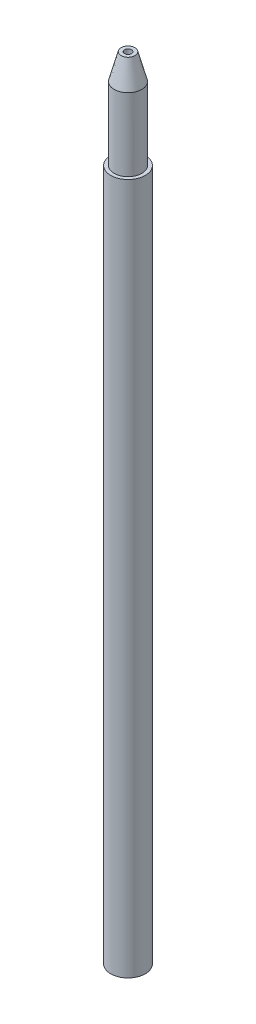
ISO-10303-21;
HEADER;
FILE_DESCRIPTION(('STEP AP214'),'2;1');
FILE_NAME('part.step','',(''),(''),'','','');
FILE_SCHEMA(('AUTOMOTIVE_DESIGN { 1 0 10303 214 1 1 1 1 }'));
ENDSEC;
DATA;
#1=APPLICATION_CONTEXT('core data for automotive mechanical design processes');
#2=APPLICATION_PROTOCOL_DEFINITION('international standard','automotive_design',2000,#1);
#3=PRODUCT_CONTEXT('',#1,'mechanical');
#4=PRODUCT('Part','Part','',(#3));
#5=PRODUCT_RELATED_PRODUCT_CATEGORY('part','',(#4));
#6=PRODUCT_DEFINITION_FORMATION('','',#4);
#7=PRODUCT_DEFINITION_CONTEXT('part definition',#1,'design');
#8=PRODUCT_DEFINITION('design','',#6,#7);
#9=PRODUCT_DEFINITION_SHAPE('','',#8);
#10=(LENGTH_UNIT() NAMED_UNIT(*) SI_UNIT(.MILLI.,.METRE.));
#11=(NAMED_UNIT(*) PLANE_ANGLE_UNIT() SI_UNIT($,.RADIAN.));
#12=(NAMED_UNIT(*) SI_UNIT($,.STERADIAN.) SOLID_ANGLE_UNIT());
#13=UNCERTAINTY_MEASURE_WITH_UNIT(LENGTH_MEASURE(1.E-05),#10,'distance_accuracy_value','');
#14=(GEOMETRIC_REPRESENTATION_CONTEXT(3) GLOBAL_UNCERTAINTY_ASSIGNED_CONTEXT((#13)) GLOBAL_UNIT_ASSIGNED_CONTEXT((#10,
#11,#12)) REPRESENTATION_CONTEXT('',''));
#15=CARTESIAN_POINT('',(0.,0.,0.));
#16=DIRECTION('',(0.,0.,1.));
#17=DIRECTION('',(1.,0.,0.));
#18=AXIS2_PLACEMENT_3D('',#15,#16,#17);
#19=CARTESIAN_POINT('',(1.00000000000001,-35.,0.));
#20=DIRECTION('',(0.,-1.,0.));
#21=DIRECTION('',(0.,0.,-1.));
#22=AXIS2_PLACEMENT_3D('',#19,#20,#21);
#23=PLANE('',#22);
#24=CARTESIAN_POINT('',(0.,-35.,0.));
#25=DIRECTION('',(0.,-1.,0.));
#26=DIRECTION('',(0.,0.,-1.));
#27=AXIS2_PLACEMENT_3D('',#24,#25,#26);
#28=CIRCLE('',#27,1.5);
#29=CARTESIAN_POINT('',(0.,-35.,-1.5));
#30=VERTEX_POINT('',#29);
#31=EDGE_CURVE('E67',#30,#30,#28,.T.);
#32=ORIENTED_EDGE('',*,*,#31,.F.);
#33=EDGE_LOOP('',(#32));
#34=FACE_BOUND('',#33,.T.);
#35=CARTESIAN_POINT('',(0.,-35.,0.));
#36=DIRECTION('',(0.,-1.,0.));
#37=DIRECTION('',(0.,0.,-1.));
#38=AXIS2_PLACEMENT_3D('',#35,#36,#37);
#39=CIRCLE('',#38,5.00000000000001);
#40=CARTESIAN_POINT('',(0.,-35.,-5.00000000000001));
#41=VERTEX_POINT('',#40);
#42=EDGE_CURVE('E55',#41,#41,#39,.T.);
#43=ORIENTED_EDGE('',*,*,#42,.T.);
#44=EDGE_LOOP('',(#43));
#45=FACE_BOUND('',#44,.T.);
#46=ADVANCED_FACE('F35',(#34,#45),#23,.T.);
#47=CARTESIAN_POINT('',(0.,0.,0.));
#48=DIRECTION('',(0.,-1.,0.));
#49=DIRECTION('',(0.,0.,-1.));
#50=AXIS2_PLACEMENT_3D('',#47,#48,#49);
#51=CYLINDRICAL_SURFACE('',#50,1.);
#52=CARTESIAN_POINT('',(0.,5.30043030951379,0.));
#53=DIRECTION('',(0.,-1.,0.));
#54=DIRECTION('',(0.,0.,-1.));
#55=AXIS2_PLACEMENT_3D('',#52,#53,#54);
#56=CIRCLE('',#55,1.);
#57=CARTESIAN_POINT('',(0.,5.30043030951379,-1.));
#58=VERTEX_POINT('',#57);
#59=EDGE_CURVE('E53',#58,#58,#56,.F.);
#60=ORIENTED_EDGE('',*,*,#59,.F.);
#61=EDGE_LOOP('',(#60));
#62=FACE_BOUND('',#61,.T.);
#63=CARTESIAN_POINT('',(0.,193.5,0.));
#64=DIRECTION('',(0.,-1.,0.));
#65=DIRECTION('',(0.,0.,-1.));
#66=AXIS2_PLACEMENT_3D('',#63,#64,#65);
#67=CIRCLE('',#66,1.);
#68=CARTESIAN_POINT('',(0.,193.5,-1.));
#69=VERTEX_POINT('',#68);
#70=EDGE_CURVE('E46',#69,#69,#67,.T.);
#71=ORIENTED_EDGE('',*,*,#70,.F.);
#72=EDGE_LOOP('',(#71));
#73=FACE_BOUND('',#72,.T.);
#74=ADVANCED_FACE('F75',(#62,#73),#51,.F.);
#75=CARTESIAN_POINT('',(1.,193.5,0.));
#76=DIRECTION('',(0.,1.,0.));
#77=DIRECTION('',(0.,0.,1.));
#78=AXIS2_PLACEMENT_3D('',#75,#76,#77);
#79=PLANE('',#78);
#80=CARTESIAN_POINT('',(0.,193.5,0.));
#81=DIRECTION('',(0.,1.,0.));
#82=DIRECTION('',(0.,0.,1.));
#83=AXIS2_PLACEMENT_3D('',#80,#81,#82);
#84=CIRCLE('',#83,1.9999999999999);
#85=CARTESIAN_POINT('',(0.,193.5,1.9999999999999));
#86=VERTEX_POINT('',#85);
#87=EDGE_CURVE('E10',#86,#86,#84,.T.);
#88=ORIENTED_EDGE('',*,*,#87,.T.);
#89=EDGE_LOOP('',(#88));
#90=FACE_BOUND('',#89,.T.);
#91=ORIENTED_EDGE('',*,*,#70,.T.);
#92=EDGE_LOOP('',(#91));
#93=FACE_BOUND('',#92,.T.);
#94=ADVANCED_FACE('F97',(#90,#93),#79,.T.);
#95=CARTESIAN_POINT('',(0.,0.,0.));
#96=DIRECTION('',(0.,-1.,0.));
#97=DIRECTION('',(0.,0.,-1.));
#98=AXIS2_PLACEMENT_3D('',#95,#96,#97);
#99=CYLINDRICAL_SURFACE('',#98,3.99999999999999);
#100=CARTESIAN_POINT('',(0.,186.035898384862,0.));
#101=DIRECTION('',(0.,1.,0.));
#102=DIRECTION('',(0.,0.,1.));
#103=AXIS2_PLACEMENT_3D('',#100,#101,#102);
#104=CIRCLE('',#103,3.99999999999999);
#105=CARTESIAN_POINT('',(0.,186.035898384862,3.99999999999999));
#106=VERTEX_POINT('',#105);
#107=EDGE_CURVE('E42',#106,#106,#104,.F.);
#108=ORIENTED_EDGE('',*,*,#107,.T.);
#109=EDGE_LOOP('',(#108));
#110=FACE_BOUND('',#109,.T.);
#111=CARTESIAN_POINT('',(0.,165.,0.));
#112=DIRECTION('',(0.,-1.,0.));
#113=DIRECTION('',(0.,0.,-1.));
#114=AXIS2_PLACEMENT_3D('',#111,#112,#113);
#115=CIRCLE('',#114,3.99999999999999);
#116=CARTESIAN_POINT('',(0.,165.,-3.99999999999999));
#117=VERTEX_POINT('',#116);
#118=EDGE_CURVE('E50',#117,#117,#115,.T.);
#119=ORIENTED_EDGE('',*,*,#118,.F.);
#120=EDGE_LOOP('',(#119));
#121=FACE_BOUND('',#120,.T.);
#122=ADVANCED_FACE('F90',(#110,#121),#99,.T.);
#123=CARTESIAN_POINT('',(3.99999999999999,165.,0.));
#124=DIRECTION('',(0.,1.,0.));
#125=DIRECTION('',(0.,0.,1.));
#126=AXIS2_PLACEMENT_3D('',#123,#124,#125);
#127=PLANE('',#126);
#128=ORIENTED_EDGE('',*,*,#118,.T.);
#129=EDGE_LOOP('',(#128));
#130=FACE_BOUND('',#129,.T.);
#131=CARTESIAN_POINT('',(0.,165.,0.));
#132=DIRECTION('',(0.,-1.,0.));
#133=DIRECTION('',(0.,0.,-1.));
#134=AXIS2_PLACEMENT_3D('',#131,#132,#133);
#135=CIRCLE('',#134,4.99999999999998);
#136=CARTESIAN_POINT('',(0.,165.,-4.99999999999998));
#137=VERTEX_POINT('',#136);
#138=EDGE_CURVE('E60',#137,#137,#135,.T.);
#139=ORIENTED_EDGE('',*,*,#138,.F.);
#140=EDGE_LOOP('',(#139));
#141=FACE_BOUND('',#140,.T.);
#142=ADVANCED_FACE('F81',(#130,#141),#127,.T.);
#143=CARTESIAN_POINT('',(0.,0.,0.));
#144=DIRECTION('',(0.,-1.,0.));
#145=DIRECTION('',(0.,0.,-1.));
#146=AXIS2_PLACEMENT_3D('',#143,#144,#145);
#147=CYLINDRICAL_SURFACE('',#146,5.);
#148=ORIENTED_EDGE('',*,*,#138,.T.);
#149=EDGE_LOOP('',(#148));
#150=FACE_BOUND('',#149,.T.);
#151=ORIENTED_EDGE('',*,*,#42,.F.);
#152=EDGE_LOOP('',(#151));
#153=FACE_BOUND('',#152,.T.);
#154=ADVANCED_FACE('F78',(#150,#153),#147,.T.);
#155=CARTESIAN_POINT('',(0.,5.00000000000001,0.));
#156=DIRECTION('',(0.,-1.,0.));
#157=DIRECTION('',(0.,0.,-1.));
#158=AXIS2_PLACEMENT_3D('',#155,#156,#157);
#159=CONICAL_SURFACE('',#158,1.49999999999999,1.02974425867665);
#160=ORIENTED_EDGE('',*,*,#59,.T.);
#161=EDGE_LOOP('',(#160));
#162=FACE_BOUND('',#161,.T.);
#163=CARTESIAN_POINT('',(0.,5.00000000000001,0.));
#164=DIRECTION('',(0.,-1.,0.));
#165=DIRECTION('',(0.,0.,-1.));
#166=AXIS2_PLACEMENT_3D('',#163,#164,#165);
#167=CIRCLE('',#166,1.49999999999999);
#168=CARTESIAN_POINT('',(0.,5.00000000000001,-1.49999999999999));
#169=VERTEX_POINT('',#168);
#170=EDGE_CURVE('E56',#169,#169,#167,.T.);
#171=ORIENTED_EDGE('',*,*,#170,.T.);
#172=EDGE_LOOP('',(#171));
#173=FACE_BOUND('',#172,.T.);
#174=ADVANCED_FACE('F80',(#162,#173),#159,.F.);
#175=CARTESIAN_POINT('',(0.,-35.,0.));
#176=DIRECTION('',(0.,-1.,0.));
#177=DIRECTION('',(0.,0.,-1.));
#178=AXIS2_PLACEMENT_3D('',#175,#176,#177);
#179=CYLINDRICAL_SURFACE('',#178,1.49999999999999);
#180=ORIENTED_EDGE('',*,*,#170,.F.);
#181=EDGE_LOOP('',(#180));
#182=FACE_BOUND('',#181,.T.);
#183=ORIENTED_EDGE('',*,*,#31,.T.);
#184=EDGE_LOOP('',(#183));
#185=FACE_BOUND('',#184,.T.);
#186=ADVANCED_FACE('F71',(#182,#185),#179,.F.);
#187=CARTESIAN_POINT('',(0.,186.035898384862,0.));
#188=DIRECTION('',(0.,-1.,0.));
#189=DIRECTION('',(0.,0.,-1.));
#190=AXIS2_PLACEMENT_3D('',#187,#188,#189);
#191=CONICAL_SURFACE('',#190,3.99999999999999,0.261799387799148);
#192=ORIENTED_EDGE('',*,*,#87,.F.);
#193=EDGE_LOOP('',(#192));
#194=FACE_BOUND('',#193,.T.);
#195=ORIENTED_EDGE('',*,*,#107,.F.);
#196=EDGE_LOOP('',(#195));
#197=FACE_BOUND('',#196,.T.);
#198=ADVANCED_FACE('F37',(#194,#197),#191,.T.);
#199=CLOSED_SHELL('',(#46,#74,#94,#122,#142,#154,#174,#186,#198));
#200=MANIFOLD_SOLID_BREP('B2',#199);
#201=ADVANCED_BREP_SHAPE_REPRESENTATION('',(#18,#200),#14);
#202=SHAPE_DEFINITION_REPRESENTATION(#9,#201);
ENDSEC;
END-ISO-10303-21;
